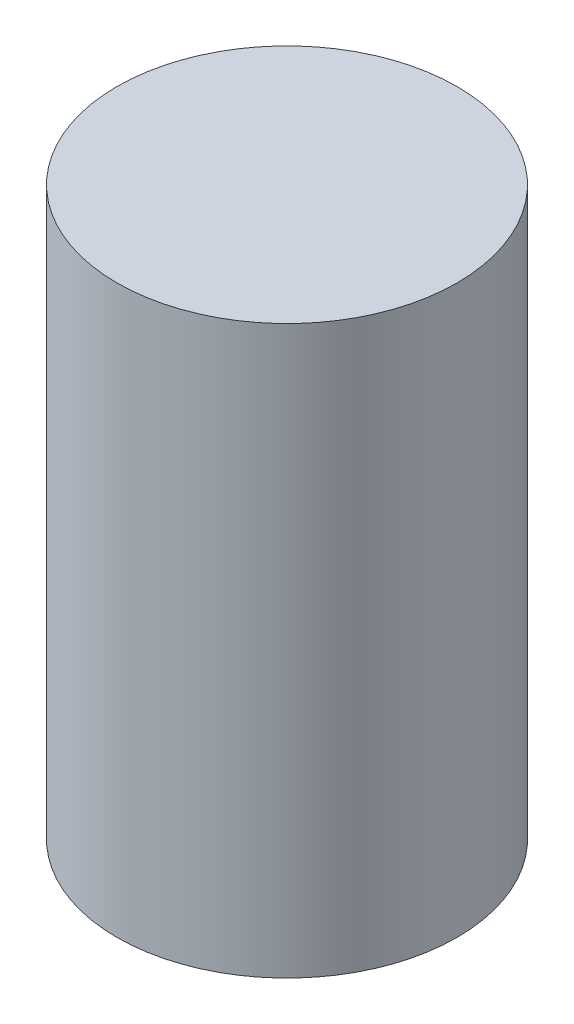
ISO-10303-21;
HEADER;
FILE_DESCRIPTION(('STEP AP214'),'2;1');
FILE_NAME('part.step','',(''),(''),'','','');
FILE_SCHEMA(('AUTOMOTIVE_DESIGN { 1 0 10303 214 1 1 1 1 }'));
ENDSEC;
DATA;
#1=APPLICATION_CONTEXT('core data for automotive mechanical design processes');
#2=APPLICATION_PROTOCOL_DEFINITION('international standard','automotive_design',2000,#1);
#3=PRODUCT_CONTEXT('',#1,'mechanical');
#4=PRODUCT('Part','Part','',(#3));
#5=PRODUCT_RELATED_PRODUCT_CATEGORY('part','',(#4));
#6=PRODUCT_DEFINITION_FORMATION('','',#4);
#7=PRODUCT_DEFINITION_CONTEXT('part definition',#1,'design');
#8=PRODUCT_DEFINITION('design','',#6,#7);
#9=PRODUCT_DEFINITION_SHAPE('','',#8);
#10=(LENGTH_UNIT() NAMED_UNIT(*) SI_UNIT(.MILLI.,.METRE.));
#11=(NAMED_UNIT(*) PLANE_ANGLE_UNIT() SI_UNIT($,.RADIAN.));
#12=(NAMED_UNIT(*) SI_UNIT($,.STERADIAN.) SOLID_ANGLE_UNIT());
#13=UNCERTAINTY_MEASURE_WITH_UNIT(LENGTH_MEASURE(1.E-05),#10,'distance_accuracy_value','');
#14=(GEOMETRIC_REPRESENTATION_CONTEXT(3) GLOBAL_UNCERTAINTY_ASSIGNED_CONTEXT((#13)) GLOBAL_UNIT_ASSIGNED_CONTEXT((#10,
#11,#12)) REPRESENTATION_CONTEXT('',''));
#15=CARTESIAN_POINT('',(0.,0.,0.));
#16=DIRECTION('',(0.,0.,1.));
#17=DIRECTION('',(1.,0.,0.));
#18=AXIS2_PLACEMENT_3D('',#15,#16,#17);
#19=CARTESIAN_POINT('',(0.,-5.,0.));
#20=DIRECTION('',(0.,1.,0.));
#21=DIRECTION('',(0.,0.,1.));
#22=AXIS2_PLACEMENT_3D('',#19,#20,#21);
#23=CYLINDRICAL_SURFACE('',#22,1.5);
#24=CARTESIAN_POINT('',(0.,-5.,0.));
#25=DIRECTION('',(0.,1.,0.));
#26=DIRECTION('',(0.,0.,1.));
#27=AXIS2_PLACEMENT_3D('',#24,#25,#26);
#28=CIRCLE('',#27,1.5);
#29=CARTESIAN_POINT('',(0.,-5.,1.5));
#30=VERTEX_POINT('',#29);
#31=EDGE_CURVE('E10',#30,#30,#28,.T.);
#32=ORIENTED_EDGE('',*,*,#31,.T.);
#33=EDGE_LOOP('',(#32));
#34=FACE_BOUND('',#33,.T.);
#35=CARTESIAN_POINT('',(0.,0.,0.));
#36=DIRECTION('',(0.,1.,0.));
#37=DIRECTION('',(0.,0.,1.));
#38=AXIS2_PLACEMENT_3D('',#35,#36,#37);
#39=CIRCLE('',#38,1.5);
#40=CARTESIAN_POINT('',(0.,0.,1.5));
#41=VERTEX_POINT('',#40);
#42=EDGE_CURVE('E40',#41,#41,#39,.T.);
#43=ORIENTED_EDGE('',*,*,#42,.F.);
#44=EDGE_LOOP('',(#43));
#45=FACE_BOUND('',#44,.T.);
#46=ADVANCED_FACE('F37',(#34,#45),#23,.T.);
#47=CARTESIAN_POINT('',(0.,-5.,0.));
#48=DIRECTION('',(0.,1.,0.));
#49=DIRECTION('',(0.,0.,1.));
#50=AXIS2_PLACEMENT_3D('',#47,#48,#49);
#51=PLANE('',#50);
#52=ORIENTED_EDGE('',*,*,#31,.F.);
#53=EDGE_LOOP('',(#52));
#54=FACE_BOUND('',#53,.T.);
#55=ADVANCED_FACE('F54',(#54),#51,.F.);
#56=CARTESIAN_POINT('',(0.,0.,0.));
#57=DIRECTION('',(0.,1.,0.));
#58=DIRECTION('',(0.,0.,1.));
#59=AXIS2_PLACEMENT_3D('',#56,#57,#58);
#60=PLANE('',#59);
#61=ORIENTED_EDGE('',*,*,#42,.T.);
#62=EDGE_LOOP('',(#61));
#63=FACE_BOUND('',#62,.T.);
#64=ADVANCED_FACE('F51',(#63),#60,.T.);
#65=CLOSED_SHELL('',(#46,#55,#64));
#66=MANIFOLD_SOLID_BREP('B2',#65);
#67=ADVANCED_BREP_SHAPE_REPRESENTATION('',(#18,#66),#14);
#68=SHAPE_DEFINITION_REPRESENTATION(#9,#67);
ENDSEC;
END-ISO-10303-21;
